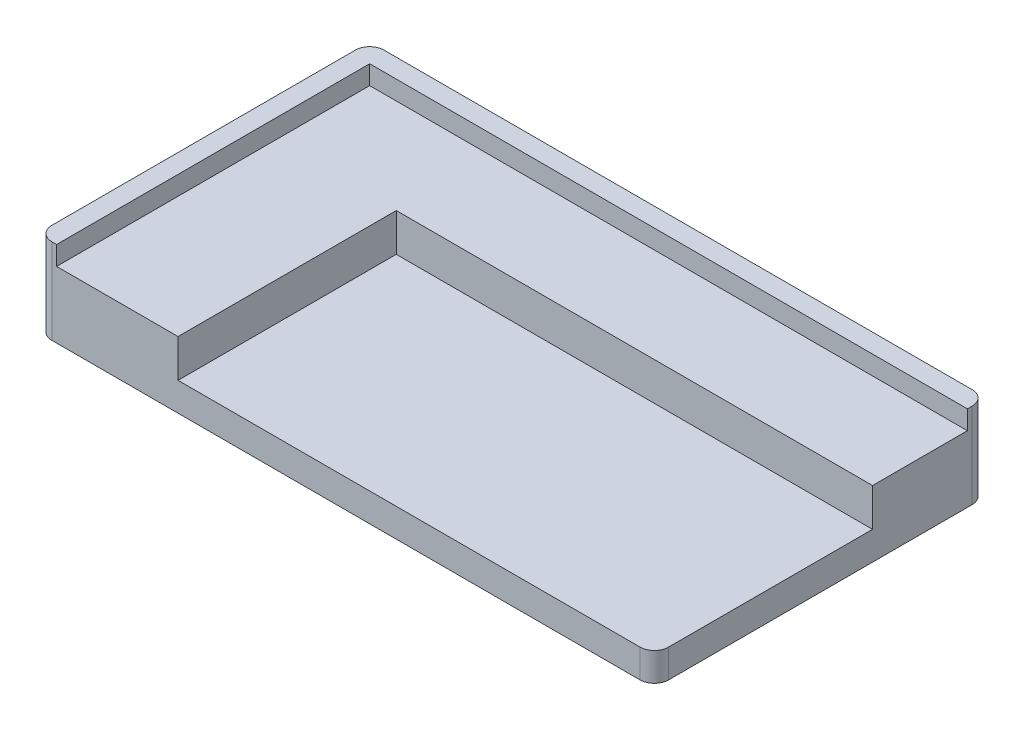
ISO-10303-21;
HEADER;
FILE_DESCRIPTION(('STEP AP214'),'2;1');
FILE_NAME('part.step','',(''),(''),'','','');
FILE_SCHEMA(('AUTOMOTIVE_DESIGN { 1 0 10303 214 1 1 1 1 }'));
ENDSEC;
DATA;
#1=APPLICATION_CONTEXT('core data for automotive mechanical design processes');
#2=APPLICATION_PROTOCOL_DEFINITION('international standard','automotive_design',2000,#1);
#3=PRODUCT_CONTEXT('',#1,'mechanical');
#4=PRODUCT('Part','Part','',(#3));
#5=PRODUCT_RELATED_PRODUCT_CATEGORY('part','',(#4));
#6=PRODUCT_DEFINITION_FORMATION('','',#4);
#7=PRODUCT_DEFINITION_CONTEXT('part definition',#1,'design');
#8=PRODUCT_DEFINITION('design','',#6,#7);
#9=PRODUCT_DEFINITION_SHAPE('','',#8);
#10=(LENGTH_UNIT() NAMED_UNIT(*) SI_UNIT(.MILLI.,.METRE.));
#11=(NAMED_UNIT(*) PLANE_ANGLE_UNIT() SI_UNIT($,.RADIAN.));
#12=(NAMED_UNIT(*) SI_UNIT($,.STERADIAN.) SOLID_ANGLE_UNIT());
#13=UNCERTAINTY_MEASURE_WITH_UNIT(LENGTH_MEASURE(1.E-05),#10,'distance_accuracy_value','');
#14=(GEOMETRIC_REPRESENTATION_CONTEXT(3) GLOBAL_UNCERTAINTY_ASSIGNED_CONTEXT((#13)) GLOBAL_UNIT_ASSIGNED_CONTEXT((#10,
#11,#12)) REPRESENTATION_CONTEXT('',''));
#15=CARTESIAN_POINT('',(0.,0.,0.));
#16=DIRECTION('',(0.,0.,1.));
#17=DIRECTION('',(1.,0.,0.));
#18=AXIS2_PLACEMENT_3D('',#15,#16,#17);
#19=CARTESIAN_POINT('',(0.,9.,0.));
#20=DIRECTION('',(1.,0.,0.));
#21=DIRECTION('',(0.,0.,-1.));
#22=AXIS2_PLACEMENT_3D('',#19,#20,#21);
#23=PLANE('',#22);
#24=DIRECTION('',(0.,0.,1.));
#25=VECTOR('',#24,1.);
#26=CARTESIAN_POINT('',(0.,0.,0.));
#27=LINE('',#26,#25);
#28=CARTESIAN_POINT('',(0.,0.,-33.5));
#29=VERTEX_POINT('',#28);
#30=CARTESIAN_POINT('',(0.,0.,-1.5));
#31=VERTEX_POINT('',#30);
#32=EDGE_CURVE('E193',#29,#31,#27,.T.);
#33=ORIENTED_EDGE('',*,*,#32,.T.);
#34=DIRECTION('',(0.,-1.,0.));
#35=VECTOR('',#34,1.);
#36=CARTESIAN_POINT('',(0.,9.,-1.5));
#37=LINE('',#36,#35);
#38=CARTESIAN_POINT('',(0.,9.,-1.5));
#39=VERTEX_POINT('',#38);
#40=EDGE_CURVE('E232',#31,#39,#37,.F.);
#41=ORIENTED_EDGE('',*,*,#40,.T.);
#42=DIRECTION('',(0.,0.,1.));
#43=VECTOR('',#42,1.);
#44=CARTESIAN_POINT('',(0.,9.,0.));
#45=LINE('',#44,#43);
#46=CARTESIAN_POINT('',(0.,9.,-33.5));
#47=VERTEX_POINT('',#46);
#48=EDGE_CURVE('E198',#47,#39,#45,.T.);
#49=ORIENTED_EDGE('',*,*,#48,.F.);
#50=DIRECTION('',(0.,-1.,0.));
#51=VECTOR('',#50,1.);
#52=CARTESIAN_POINT('',(0.,9.,-33.5));
#53=LINE('',#52,#51);
#54=EDGE_CURVE('E229',#47,#29,#53,.T.);
#55=ORIENTED_EDGE('',*,*,#54,.T.);
#56=EDGE_LOOP('',(#33,#41,#49,#55));
#57=FACE_BOUND('',#56,.T.);
#58=ADVANCED_FACE('F37',(#57),#23,.F.);
#59=CARTESIAN_POINT('',(0.,9.,0.));
#60=DIRECTION('',(0.,0.,-1.));
#61=DIRECTION('',(-1.,0.,0.));
#62=AXIS2_PLACEMENT_3D('',#59,#60,#61);
#63=PLANE('',#62);
#64=DIRECTION('',(1.,0.,0.));
#65=VECTOR('',#64,1.);
#66=CARTESIAN_POINT('',(0.,9.,0.));
#67=LINE('',#66,#65);
#68=CARTESIAN_POINT('',(1.5,9.,0.));
#69=VERTEX_POINT('',#68);
#70=CARTESIAN_POINT('',(1.99999999999999,9.,0.));
#71=VERTEX_POINT('',#70);
#72=EDGE_CURVE('E201',#69,#71,#67,.T.);
#73=ORIENTED_EDGE('',*,*,#72,.F.);
#74=DIRECTION('',(0.,-1.,0.));
#75=VECTOR('',#74,1.);
#76=CARTESIAN_POINT('',(1.5,9.,0.));
#77=LINE('',#76,#75);
#78=CARTESIAN_POINT('',(1.5,0.,0.));
#79=VERTEX_POINT('',#78);
#80=EDGE_CURVE('E218',#69,#79,#77,.T.);
#81=ORIENTED_EDGE('',*,*,#80,.T.);
#82=DIRECTION('',(1.,0.,0.));
#83=VECTOR('',#82,1.);
#84=CARTESIAN_POINT('',(0.,0.,0.));
#85=LINE('',#84,#83);
#86=CARTESIAN_POINT('',(63.5,0.,0.));
#87=VERTEX_POINT('',#86);
#88=EDGE_CURVE('E211',#79,#87,#85,.T.);
#89=ORIENTED_EDGE('',*,*,#88,.T.);
#90=DIRECTION('',(0.,-1.,0.));
#91=VECTOR('',#90,1.);
#92=CARTESIAN_POINT('',(63.5,9.,0.));
#93=LINE('',#92,#91);
#94=CARTESIAN_POINT('',(63.5,3.,0.));
#95=VERTEX_POINT('',#94);
#96=EDGE_CURVE('E162',#87,#95,#93,.F.);
#97=ORIENTED_EDGE('',*,*,#96,.T.);
#98=DIRECTION('',(1.,0.,0.));
#99=VECTOR('',#98,1.);
#100=CARTESIAN_POINT('',(14.8,3.,0.));
#101=LINE('',#100,#99);
#102=CARTESIAN_POINT('',(14.8,3.,0.));
#103=VERTEX_POINT('',#102);
#104=EDGE_CURVE('E154',#103,#95,#101,.T.);
#105=ORIENTED_EDGE('',*,*,#104,.F.);
#106=DIRECTION('',(0.,1.,0.));
#107=VECTOR('',#106,1.);
#108=CARTESIAN_POINT('',(14.8,3.,0.));
#109=LINE('',#108,#107);
#110=CARTESIAN_POINT('',(14.8,7.,0.));
#111=VERTEX_POINT('',#110);
#112=EDGE_CURVE('E139',#103,#111,#109,.T.);
#113=ORIENTED_EDGE('',*,*,#112,.T.);
#114=DIRECTION('',(1.,0.,0.));
#115=VECTOR('',#114,1.);
#116=CARTESIAN_POINT('',(1.99999999999999,7.,0.));
#117=LINE('',#116,#115);
#118=CARTESIAN_POINT('',(1.99999999999999,7.,0.));
#119=VERTEX_POINT('',#118);
#120=EDGE_CURVE('E178',#119,#111,#117,.T.);
#121=ORIENTED_EDGE('',*,*,#120,.F.);
#122=DIRECTION('',(0.,1.,0.));
#123=VECTOR('',#122,1.);
#124=CARTESIAN_POINT('',(1.99999999999999,7.,0.));
#125=LINE('',#124,#123);
#126=EDGE_CURVE('E186',#119,#71,#125,.T.);
#127=ORIENTED_EDGE('',*,*,#126,.T.);
#128=EDGE_LOOP('',(#73,#81,#89,#97,#105,#113,#121,#127));
#129=FACE_BOUND('',#128,.T.);
#130=ADVANCED_FACE('F159',(#129),#63,.F.);
#131=CARTESIAN_POINT('',(65.,9.,0.));
#132=DIRECTION('',(-1.,0.,0.));
#133=DIRECTION('',(0.,0.,1.));
#134=AXIS2_PLACEMENT_3D('',#131,#132,#133);
#135=PLANE('',#134);
#136=DIRECTION('',(0.,0.,-1.));
#137=VECTOR('',#136,1.);
#138=CARTESIAN_POINT('',(65.,3.,-23.));
#139=LINE('',#138,#137);
#140=CARTESIAN_POINT('',(65.,3.,-1.5));
#141=VERTEX_POINT('',#140);
#142=CARTESIAN_POINT('',(65.,3.,-23.));
#143=VERTEX_POINT('',#142);
#144=EDGE_CURVE('E163',#141,#143,#139,.T.);
#145=ORIENTED_EDGE('',*,*,#144,.F.);
#146=DIRECTION('',(0.,-1.,0.));
#147=VECTOR('',#146,1.);
#148=CARTESIAN_POINT('',(65.,9.,-1.5));
#149=LINE('',#148,#147);
#150=CARTESIAN_POINT('',(65.,0.,-1.5));
#151=VERTEX_POINT('',#150);
#152=EDGE_CURVE('E242',#141,#151,#149,.T.);
#153=ORIENTED_EDGE('',*,*,#152,.T.);
#154=DIRECTION('',(0.,0.,-1.));
#155=VECTOR('',#154,1.);
#156=CARTESIAN_POINT('',(65.,0.,0.));
#157=LINE('',#156,#155);
#158=CARTESIAN_POINT('',(65.,0.,-33.5));
#159=VERTEX_POINT('',#158);
#160=EDGE_CURVE('E213',#151,#159,#157,.T.);
#161=ORIENTED_EDGE('',*,*,#160,.T.);
#162=DIRECTION('',(0.,-1.,0.));
#163=VECTOR('',#162,1.);
#164=CARTESIAN_POINT('',(65.,9.,-33.5));
#165=LINE('',#164,#163);
#166=CARTESIAN_POINT('',(65.,9.,-33.5));
#167=VERTEX_POINT('',#166);
#168=EDGE_CURVE('E240',#159,#167,#165,.F.);
#169=ORIENTED_EDGE('',*,*,#168,.T.);
#170=DIRECTION('',(0.,0.,-1.));
#171=VECTOR('',#170,1.);
#172=CARTESIAN_POINT('',(65.,9.,0.));
#173=LINE('',#172,#171);
#174=CARTESIAN_POINT('',(65.,9.,-33.));
#175=VERTEX_POINT('',#174);
#176=EDGE_CURVE('E204',#175,#167,#173,.T.);
#177=ORIENTED_EDGE('',*,*,#176,.F.);
#178=DIRECTION('',(0.,1.,0.));
#179=VECTOR('',#178,1.);
#180=CARTESIAN_POINT('',(65.,7.,-33.));
#181=LINE('',#180,#179);
#182=CARTESIAN_POINT('',(65.,7.,-33.));
#183=VERTEX_POINT('',#182);
#184=EDGE_CURVE('E194',#183,#175,#181,.T.);
#185=ORIENTED_EDGE('',*,*,#184,.F.);
#186=DIRECTION('',(0.,0.,-1.));
#187=VECTOR('',#186,1.);
#188=CARTESIAN_POINT('',(65.,7.,-33.));
#189=LINE('',#188,#187);
#190=CARTESIAN_POINT('',(65.,7.,-23.));
#191=VERTEX_POINT('',#190);
#192=EDGE_CURVE('E181',#191,#183,#189,.T.);
#193=ORIENTED_EDGE('',*,*,#192,.F.);
#194=DIRECTION('',(0.,1.,0.));
#195=VECTOR('',#194,1.);
#196=CARTESIAN_POINT('',(65.,3.,-23.));
#197=LINE('',#196,#195);
#198=EDGE_CURVE('E150',#143,#191,#197,.T.);
#199=ORIENTED_EDGE('',*,*,#198,.F.);
#200=EDGE_LOOP('',(#145,#153,#161,#169,#177,#185,#193,#199));
#201=FACE_BOUND('',#200,.T.);
#202=ADVANCED_FACE('F273',(#201),#135,.F.);
#203=CARTESIAN_POINT('',(0.,9.,-35.));
#204=DIRECTION('',(0.,0.,1.));
#205=DIRECTION('',(1.,0.,0.));
#206=AXIS2_PLACEMENT_3D('',#203,#204,#205);
#207=PLANE('',#206);
#208=DIRECTION('',(-1.,0.,0.));
#209=VECTOR('',#208,1.);
#210=CARTESIAN_POINT('',(0.,0.,-35.));
#211=LINE('',#210,#209);
#212=CARTESIAN_POINT('',(63.5,0.,-35.));
#213=VERTEX_POINT('',#212);
#214=CARTESIAN_POINT('',(1.49999999999999,0.,-35.));
#215=VERTEX_POINT('',#214);
#216=EDGE_CURVE('E202',#213,#215,#211,.T.);
#217=ORIENTED_EDGE('',*,*,#216,.T.);
#218=DIRECTION('',(0.,-1.,0.));
#219=VECTOR('',#218,1.);
#220=CARTESIAN_POINT('',(1.49999999999999,9.,-35.));
#221=LINE('',#220,#219);
#222=CARTESIAN_POINT('',(1.49999999999999,9.,-35.));
#223=VERTEX_POINT('',#222);
#224=EDGE_CURVE('E11',#215,#223,#221,.F.);
#225=ORIENTED_EDGE('',*,*,#224,.T.);
#226=DIRECTION('',(-1.,0.,0.));
#227=VECTOR('',#226,1.);
#228=CARTESIAN_POINT('',(0.,9.,-35.));
#229=LINE('',#228,#227);
#230=CARTESIAN_POINT('',(63.5,9.,-35.));
#231=VERTEX_POINT('',#230);
#232=EDGE_CURVE('E207',#231,#223,#229,.T.);
#233=ORIENTED_EDGE('',*,*,#232,.F.);
#234=DIRECTION('',(0.,-1.,0.));
#235=VECTOR('',#234,1.);
#236=CARTESIAN_POINT('',(63.5,9.,-35.));
#237=LINE('',#236,#235);
#238=EDGE_CURVE('E45',#231,#213,#237,.T.);
#239=ORIENTED_EDGE('',*,*,#238,.T.);
#240=EDGE_LOOP('',(#217,#225,#233,#239));
#241=FACE_BOUND('',#240,.T.);
#242=ADVANCED_FACE('F248',(#241),#207,.F.);
#243=CARTESIAN_POINT('',(0.,9.,0.));
#244=DIRECTION('',(0.,-1.,0.));
#245=DIRECTION('',(0.,0.,-1.));
#246=AXIS2_PLACEMENT_3D('',#243,#244,#245);
#247=PLANE('',#246);
#248=ORIENTED_EDGE('',*,*,#48,.T.);
#249=CARTESIAN_POINT('',(1.5,9.,-1.5));
#250=DIRECTION('',(0.,-1.,0.));
#251=DIRECTION('',(0.,0.,-1.));
#252=AXIS2_PLACEMENT_3D('',#249,#250,#251);
#253=CIRCLE('',#252,1.5);
#254=EDGE_CURVE('E238',#39,#69,#253,.F.);
#255=ORIENTED_EDGE('',*,*,#254,.T.);
#256=ORIENTED_EDGE('',*,*,#72,.T.);
#257=DIRECTION('',(0.,0.,1.));
#258=VECTOR('',#257,1.);
#259=CARTESIAN_POINT('',(1.99999999999999,9.,-33.));
#260=LINE('',#259,#258);
#261=CARTESIAN_POINT('',(1.99999999999999,9.,-33.));
#262=VERTEX_POINT('',#261);
#263=EDGE_CURVE('E173',#262,#71,#260,.T.);
#264=ORIENTED_EDGE('',*,*,#263,.F.);
#265=DIRECTION('',(-1.,0.,0.));
#266=VECTOR('',#265,1.);
#267=CARTESIAN_POINT('',(1.99999999999999,9.,-33.));
#268=LINE('',#267,#266);
#269=EDGE_CURVE('E179',#175,#262,#268,.T.);
#270=ORIENTED_EDGE('',*,*,#269,.F.);
#271=ORIENTED_EDGE('',*,*,#176,.T.);
#272=CARTESIAN_POINT('',(63.5,9.,-33.5));
#273=DIRECTION('',(0.,-1.,0.));
#274=DIRECTION('',(0.,0.,-1.));
#275=AXIS2_PLACEMENT_3D('',#272,#273,#274);
#276=CIRCLE('',#275,1.5);
#277=EDGE_CURVE('E234',#167,#231,#276,.F.);
#278=ORIENTED_EDGE('',*,*,#277,.T.);
#279=ORIENTED_EDGE('',*,*,#232,.T.);
#280=CARTESIAN_POINT('',(1.49999999999999,9.,-33.5));
#281=DIRECTION('',(0.,-1.,0.));
#282=DIRECTION('',(0.,0.,-1.));
#283=AXIS2_PLACEMENT_3D('',#280,#281,#282);
#284=CIRCLE('',#283,1.5);
#285=EDGE_CURVE('E236',#223,#47,#284,.F.);
#286=ORIENTED_EDGE('',*,*,#285,.T.);
#287=EDGE_LOOP('',(#248,#255,#256,#264,#270,#271,#278,#279,#286));
#288=FACE_BOUND('',#287,.T.);
#289=ADVANCED_FACE('F265',(#288),#247,.F.);
#290=CARTESIAN_POINT('',(0.,0.,0.));
#291=DIRECTION('',(0.,-1.,0.));
#292=DIRECTION('',(0.,0.,-1.));
#293=AXIS2_PLACEMENT_3D('',#290,#291,#292);
#294=PLANE('',#293);
#295=ORIENTED_EDGE('',*,*,#88,.F.);
#296=CARTESIAN_POINT('',(1.5,0.,-1.5));
#297=DIRECTION('',(0.,-1.,0.));
#298=DIRECTION('',(0.,0.,-1.));
#299=AXIS2_PLACEMENT_3D('',#296,#297,#298);
#300=CIRCLE('',#299,1.5);
#301=EDGE_CURVE('E227',#79,#31,#300,.T.);
#302=ORIENTED_EDGE('',*,*,#301,.T.);
#303=ORIENTED_EDGE('',*,*,#32,.F.);
#304=CARTESIAN_POINT('',(1.49999999999999,0.,-33.5));
#305=DIRECTION('',(0.,-1.,0.));
#306=DIRECTION('',(0.,0.,-1.));
#307=AXIS2_PLACEMENT_3D('',#304,#305,#306);
#308=CIRCLE('',#307,1.5);
#309=EDGE_CURVE('E223',#29,#215,#308,.T.);
#310=ORIENTED_EDGE('',*,*,#309,.T.);
#311=ORIENTED_EDGE('',*,*,#216,.F.);
#312=CARTESIAN_POINT('',(63.5,0.,-33.5));
#313=DIRECTION('',(0.,-1.,0.));
#314=DIRECTION('',(0.,0.,-1.));
#315=AXIS2_PLACEMENT_3D('',#312,#313,#314);
#316=CIRCLE('',#315,1.5);
#317=EDGE_CURVE('E221',#213,#159,#316,.T.);
#318=ORIENTED_EDGE('',*,*,#317,.T.);
#319=ORIENTED_EDGE('',*,*,#160,.F.);
#320=CARTESIAN_POINT('',(63.5,0.,-1.5));
#321=DIRECTION('',(0.,-1.,0.));
#322=DIRECTION('',(0.,0.,-1.));
#323=AXIS2_PLACEMENT_3D('',#320,#321,#322);
#324=CIRCLE('',#323,1.5);
#325=EDGE_CURVE('E225',#151,#87,#324,.T.);
#326=ORIENTED_EDGE('',*,*,#325,.T.);
#327=EDGE_LOOP('',(#295,#302,#303,#310,#311,#318,#319,#326));
#328=FACE_BOUND('',#327,.T.);
#329=ADVANCED_FACE('F253',(#328),#294,.T.);
#330=CARTESIAN_POINT('',(1.99999999999999,7.,-33.));
#331=DIRECTION('',(-1.,0.,0.));
#332=DIRECTION('',(0.,0.,1.));
#333=AXIS2_PLACEMENT_3D('',#330,#331,#332);
#334=PLANE('',#333);
#335=ORIENTED_EDGE('',*,*,#263,.T.);
#336=ORIENTED_EDGE('',*,*,#126,.F.);
#337=DIRECTION('',(0.,0.,1.));
#338=VECTOR('',#337,1.);
#339=CARTESIAN_POINT('',(1.99999999999999,7.,-33.));
#340=LINE('',#339,#338);
#341=CARTESIAN_POINT('',(1.99999999999999,7.,-33.));
#342=VERTEX_POINT('',#341);
#343=EDGE_CURVE('E175',#342,#119,#340,.T.);
#344=ORIENTED_EDGE('',*,*,#343,.F.);
#345=DIRECTION('',(0.,1.,0.));
#346=VECTOR('',#345,1.);
#347=CARTESIAN_POINT('',(1.99999999999999,7.,-33.));
#348=LINE('',#347,#346);
#349=EDGE_CURVE('E191',#342,#262,#348,.T.);
#350=ORIENTED_EDGE('',*,*,#349,.T.);
#351=EDGE_LOOP('',(#335,#336,#344,#350));
#352=FACE_BOUND('',#351,.T.);
#353=ADVANCED_FACE('F284',(#352),#334,.F.);
#354=CARTESIAN_POINT('',(1.99999999999999,7.,-33.));
#355=DIRECTION('',(0.,0.,-1.));
#356=DIRECTION('',(-1.,0.,0.));
#357=AXIS2_PLACEMENT_3D('',#354,#355,#356);
#358=PLANE('',#357);
#359=ORIENTED_EDGE('',*,*,#269,.T.);
#360=ORIENTED_EDGE('',*,*,#349,.F.);
#361=DIRECTION('',(-1.,0.,0.));
#362=VECTOR('',#361,1.);
#363=CARTESIAN_POINT('',(1.99999999999999,7.,-33.));
#364=LINE('',#363,#362);
#365=EDGE_CURVE('E183',#183,#342,#364,.T.);
#366=ORIENTED_EDGE('',*,*,#365,.F.);
#367=ORIENTED_EDGE('',*,*,#184,.T.);
#368=EDGE_LOOP('',(#359,#360,#366,#367));
#369=FACE_BOUND('',#368,.T.);
#370=ADVANCED_FACE('F363',(#369),#358,.F.);
#371=CARTESIAN_POINT('',(0.,7.,0.));
#372=DIRECTION('',(0.,1.,0.));
#373=DIRECTION('',(0.,0.,1.));
#374=AXIS2_PLACEMENT_3D('',#371,#372,#373);
#375=PLANE('',#374);
#376=DIRECTION('',(0.,0.,1.));
#377=VECTOR('',#376,1.);
#378=CARTESIAN_POINT('',(14.8,7.,0.));
#379=LINE('',#378,#377);
#380=CARTESIAN_POINT('',(14.8,7.,-23.));
#381=VERTEX_POINT('',#380);
#382=EDGE_CURVE('E145',#381,#111,#379,.T.);
#383=ORIENTED_EDGE('',*,*,#382,.F.);
#384=DIRECTION('',(-1.,0.,0.));
#385=VECTOR('',#384,1.);
#386=CARTESIAN_POINT('',(14.8,7.,-23.));
#387=LINE('',#386,#385);
#388=EDGE_CURVE('E156',#191,#381,#387,.T.);
#389=ORIENTED_EDGE('',*,*,#388,.F.);
#390=ORIENTED_EDGE('',*,*,#192,.T.);
#391=ORIENTED_EDGE('',*,*,#365,.T.);
#392=ORIENTED_EDGE('',*,*,#343,.T.);
#393=ORIENTED_EDGE('',*,*,#120,.T.);
#394=EDGE_LOOP('',(#383,#389,#390,#391,#392,#393));
#395=FACE_BOUND('',#394,.T.);
#396=ADVANCED_FACE('F281',(#395),#375,.T.);
#397=CARTESIAN_POINT('',(14.8,3.,0.));
#398=DIRECTION('',(-1.,0.,0.));
#399=DIRECTION('',(0.,0.,1.));
#400=AXIS2_PLACEMENT_3D('',#397,#398,#399);
#401=PLANE('',#400);
#402=ORIENTED_EDGE('',*,*,#382,.T.);
#403=ORIENTED_EDGE('',*,*,#112,.F.);
#404=DIRECTION('',(0.,0.,1.));
#405=VECTOR('',#404,1.);
#406=CARTESIAN_POINT('',(14.8,3.,0.));
#407=LINE('',#406,#405);
#408=CARTESIAN_POINT('',(14.8,3.,-23.));
#409=VERTEX_POINT('',#408);
#410=EDGE_CURVE('E142',#409,#103,#407,.T.);
#411=ORIENTED_EDGE('',*,*,#410,.F.);
#412=DIRECTION('',(0.,1.,0.));
#413=VECTOR('',#412,1.);
#414=CARTESIAN_POINT('',(14.8,3.,-23.));
#415=LINE('',#414,#413);
#416=EDGE_CURVE('E171',#409,#381,#415,.T.);
#417=ORIENTED_EDGE('',*,*,#416,.T.);
#418=EDGE_LOOP('',(#402,#403,#411,#417));
#419=FACE_BOUND('',#418,.T.);
#420=ADVANCED_FACE('F141',(#419),#401,.F.);
#421=CARTESIAN_POINT('',(14.8,3.,-23.));
#422=DIRECTION('',(0.,0.,-1.));
#423=DIRECTION('',(-1.,0.,0.));
#424=AXIS2_PLACEMENT_3D('',#421,#422,#423);
#425=PLANE('',#424);
#426=ORIENTED_EDGE('',*,*,#388,.T.);
#427=ORIENTED_EDGE('',*,*,#416,.F.);
#428=DIRECTION('',(-1.,0.,0.));
#429=VECTOR('',#428,1.);
#430=CARTESIAN_POINT('',(14.8,3.,-23.));
#431=LINE('',#430,#429);
#432=EDGE_CURVE('E151',#143,#409,#431,.T.);
#433=ORIENTED_EDGE('',*,*,#432,.F.);
#434=ORIENTED_EDGE('',*,*,#198,.T.);
#435=EDGE_LOOP('',(#426,#427,#433,#434));
#436=FACE_BOUND('',#435,.T.);
#437=ADVANCED_FACE('F278',(#436),#425,.F.);
#438=CARTESIAN_POINT('',(0.,3.,0.));
#439=DIRECTION('',(0.,-1.,0.));
#440=DIRECTION('',(0.,0.,-1.));
#441=AXIS2_PLACEMENT_3D('',#438,#439,#440);
#442=PLANE('',#441);
#443=ORIENTED_EDGE('',*,*,#104,.T.);
#444=CARTESIAN_POINT('',(63.5,3.,-1.5));
#445=DIRECTION('',(0.,-1.,0.));
#446=DIRECTION('',(0.,0.,-1.));
#447=AXIS2_PLACEMENT_3D('',#444,#445,#446);
#448=CIRCLE('',#447,1.5);
#449=EDGE_CURVE('E52',#95,#141,#448,.F.);
#450=ORIENTED_EDGE('',*,*,#449,.T.);
#451=ORIENTED_EDGE('',*,*,#144,.T.);
#452=ORIENTED_EDGE('',*,*,#432,.T.);
#453=ORIENTED_EDGE('',*,*,#410,.T.);
#454=EDGE_LOOP('',(#443,#450,#451,#452,#453));
#455=FACE_BOUND('',#454,.T.);
#456=ADVANCED_FACE('F153',(#455),#442,.F.);
#457=CARTESIAN_POINT('',(1.5,9.,-1.5));
#458=DIRECTION('',(0.,-1.,0.));
#459=DIRECTION('',(0.,0.,-1.));
#460=AXIS2_PLACEMENT_3D('',#457,#458,#459);
#461=CYLINDRICAL_SURFACE('',#460,1.5);
#462=ORIENTED_EDGE('',*,*,#254,.F.);
#463=ORIENTED_EDGE('',*,*,#40,.F.);
#464=ORIENTED_EDGE('',*,*,#301,.F.);
#465=ORIENTED_EDGE('',*,*,#80,.F.);
#466=EDGE_LOOP('',(#462,#463,#464,#465));
#467=FACE_BOUND('',#466,.T.);
#468=ADVANCED_FACE('F268',(#467),#461,.T.);
#469=CARTESIAN_POINT('',(63.5,9.,-1.5));
#470=DIRECTION('',(0.,-1.,0.));
#471=DIRECTION('',(0.,0.,-1.));
#472=AXIS2_PLACEMENT_3D('',#469,#470,#471);
#473=CYLINDRICAL_SURFACE('',#472,1.5);
#474=ORIENTED_EDGE('',*,*,#449,.F.);
#475=ORIENTED_EDGE('',*,*,#96,.F.);
#476=ORIENTED_EDGE('',*,*,#325,.F.);
#477=ORIENTED_EDGE('',*,*,#152,.F.);
#478=EDGE_LOOP('',(#474,#475,#476,#477));
#479=FACE_BOUND('',#478,.T.);
#480=ADVANCED_FACE('F271',(#479),#473,.T.);
#481=CARTESIAN_POINT('',(1.49999999999999,9.,-33.5));
#482=DIRECTION('',(0.,-1.,0.));
#483=DIRECTION('',(0.,0.,-1.));
#484=AXIS2_PLACEMENT_3D('',#481,#482,#483);
#485=CYLINDRICAL_SURFACE('',#484,1.5);
#486=ORIENTED_EDGE('',*,*,#285,.F.);
#487=ORIENTED_EDGE('',*,*,#224,.F.);
#488=ORIENTED_EDGE('',*,*,#309,.F.);
#489=ORIENTED_EDGE('',*,*,#54,.F.);
#490=EDGE_LOOP('',(#486,#487,#488,#489));
#491=FACE_BOUND('',#490,.T.);
#492=ADVANCED_FACE('F259',(#491),#485,.T.);
#493=CARTESIAN_POINT('',(63.5,9.,-33.5));
#494=DIRECTION('',(0.,-1.,0.));
#495=DIRECTION('',(0.,0.,-1.));
#496=AXIS2_PLACEMENT_3D('',#493,#494,#495);
#497=CYLINDRICAL_SURFACE('',#496,1.5);
#498=ORIENTED_EDGE('',*,*,#277,.F.);
#499=ORIENTED_EDGE('',*,*,#168,.F.);
#500=ORIENTED_EDGE('',*,*,#317,.F.);
#501=ORIENTED_EDGE('',*,*,#238,.F.);
#502=EDGE_LOOP('',(#498,#499,#500,#501));
#503=FACE_BOUND('',#502,.T.);
#504=ADVANCED_FACE('F39',(#503),#497,.T.);
#505=CLOSED_SHELL('',(#58,#130,#202,#242,#289,#329,#353,#370,#396,#420,#437,#456,#468,#480,#492,#504));
#506=MANIFOLD_SOLID_BREP('B2',#505);
#507=ADVANCED_BREP_SHAPE_REPRESENTATION('',(#18,#506),#14);
#508=SHAPE_DEFINITION_REPRESENTATION(#9,#507);
ENDSEC;
END-ISO-10303-21;
